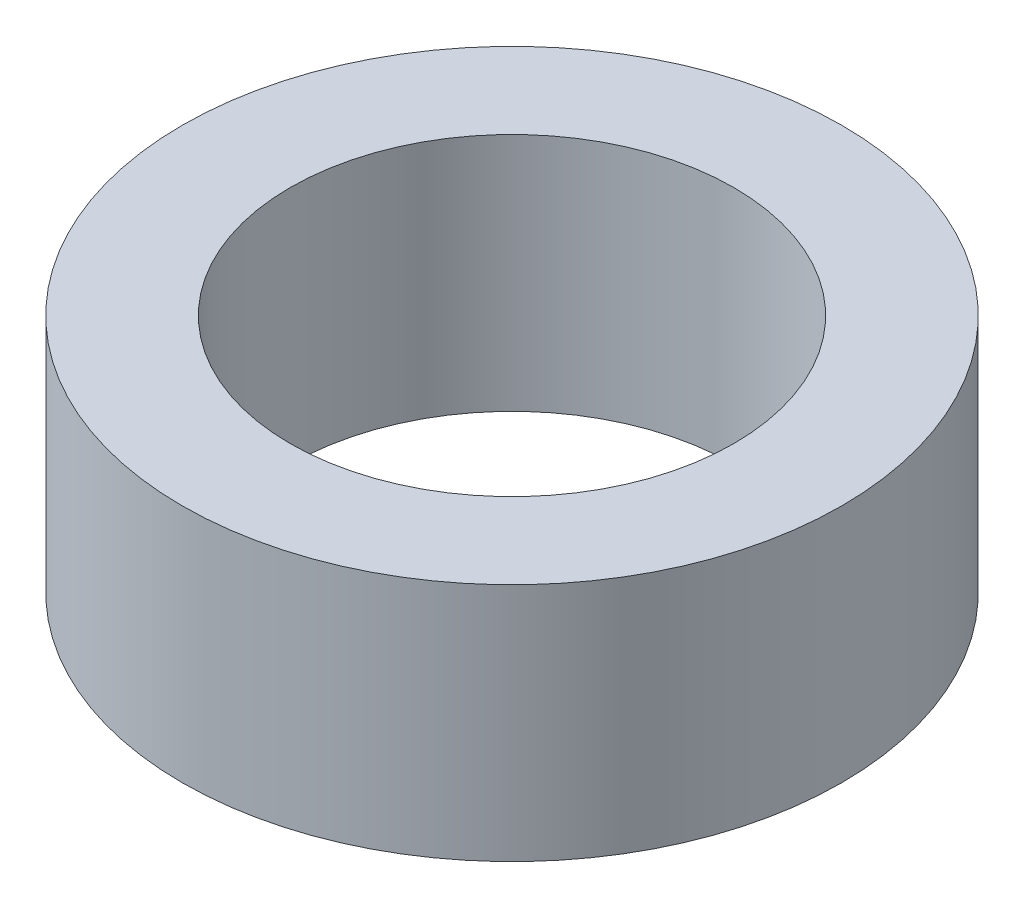
ISO-10303-21;
HEADER;
FILE_DESCRIPTION(('STEP AP214'),'2;1');
FILE_NAME('part.step','',(''),(''),'','','');
FILE_SCHEMA(('AUTOMOTIVE_DESIGN { 1 0 10303 214 1 1 1 1 }'));
ENDSEC;
DATA;
#1=APPLICATION_CONTEXT('core data for automotive mechanical design processes');
#2=APPLICATION_PROTOCOL_DEFINITION('international standard','automotive_design',2000,#1);
#3=PRODUCT_CONTEXT('',#1,'mechanical');
#4=PRODUCT('Part','Part','',(#3));
#5=PRODUCT_RELATED_PRODUCT_CATEGORY('part','',(#4));
#6=PRODUCT_DEFINITION_FORMATION('','',#4);
#7=PRODUCT_DEFINITION_CONTEXT('part definition',#1,'design');
#8=PRODUCT_DEFINITION('design','',#6,#7);
#9=PRODUCT_DEFINITION_SHAPE('','',#8);
#10=(LENGTH_UNIT() NAMED_UNIT(*) SI_UNIT(.MILLI.,.METRE.));
#11=(NAMED_UNIT(*) PLANE_ANGLE_UNIT() SI_UNIT($,.RADIAN.));
#12=(NAMED_UNIT(*) SI_UNIT($,.STERADIAN.) SOLID_ANGLE_UNIT());
#13=UNCERTAINTY_MEASURE_WITH_UNIT(LENGTH_MEASURE(1.E-05),#10,'distance_accuracy_value','');
#14=(GEOMETRIC_REPRESENTATION_CONTEXT(3) GLOBAL_UNCERTAINTY_ASSIGNED_CONTEXT((#13)) GLOBAL_UNIT_ASSIGNED_CONTEXT((#10,
#11,#12)) REPRESENTATION_CONTEXT('',''));
#15=CARTESIAN_POINT('',(0.,0.,0.));
#16=DIRECTION('',(0.,0.,1.));
#17=DIRECTION('',(1.,0.,0.));
#18=AXIS2_PLACEMENT_3D('',#15,#16,#17);
#19=CARTESIAN_POINT('',(0.,5.08,0.));
#20=DIRECTION('',(0.,1.,0.));
#21=DIRECTION('',(0.,0.,1.));
#22=AXIS2_PLACEMENT_3D('',#19,#20,#21);
#23=PLANE('',#22);
#24=CARTESIAN_POINT('',(0.,5.08,0.));
#25=DIRECTION('',(0.,1.,0.));
#26=DIRECTION('',(0.,0.,1.));
#27=AXIS2_PLACEMENT_3D('',#24,#25,#26);
#28=CIRCLE('',#27,6.985);
#29=CARTESIAN_POINT('',(0.,5.08,6.985));
#30=VERTEX_POINT('',#29);
#31=EDGE_CURVE('E10',#30,#30,#28,.T.);
#32=ORIENTED_EDGE('',*,*,#31,.T.);
#33=EDGE_LOOP('',(#32));
#34=FACE_BOUND('',#33,.T.);
#35=CARTESIAN_POINT('',(0.,5.08,0.));
#36=DIRECTION('',(0.,1.,0.));
#37=DIRECTION('',(0.,0.,1.));
#38=AXIS2_PLACEMENT_3D('',#35,#36,#37);
#39=CIRCLE('',#38,4.699);
#40=CARTESIAN_POINT('',(0.,5.08,4.699));
#41=VERTEX_POINT('',#40);
#42=EDGE_CURVE('E48',#41,#41,#39,.T.);
#43=ORIENTED_EDGE('',*,*,#42,.F.);
#44=EDGE_LOOP('',(#43));
#45=FACE_BOUND('',#44,.T.);
#46=ADVANCED_FACE('F37',(#34,#45),#23,.T.);
#47=CARTESIAN_POINT('',(0.,0.,0.));
#48=DIRECTION('',(0.,1.,0.));
#49=DIRECTION('',(0.,0.,1.));
#50=AXIS2_PLACEMENT_3D('',#47,#48,#49);
#51=PLANE('',#50);
#52=CARTESIAN_POINT('',(0.,0.,0.));
#53=DIRECTION('',(0.,1.,0.));
#54=DIRECTION('',(0.,0.,1.));
#55=AXIS2_PLACEMENT_3D('',#52,#53,#54);
#56=CIRCLE('',#55,6.985);
#57=CARTESIAN_POINT('',(0.,0.,6.985));
#58=VERTEX_POINT('',#57);
#59=EDGE_CURVE('E41',#58,#58,#56,.T.);
#60=ORIENTED_EDGE('',*,*,#59,.F.);
#61=EDGE_LOOP('',(#60));
#62=FACE_BOUND('',#61,.T.);
#63=CARTESIAN_POINT('',(0.,0.,0.));
#64=DIRECTION('',(0.,1.,0.));
#65=DIRECTION('',(0.,0.,1.));
#66=AXIS2_PLACEMENT_3D('',#63,#64,#65);
#67=CIRCLE('',#66,4.699);
#68=CARTESIAN_POINT('',(0.,0.,4.699));
#69=VERTEX_POINT('',#68);
#70=EDGE_CURVE('E50',#69,#69,#67,.T.);
#71=ORIENTED_EDGE('',*,*,#70,.T.);
#72=EDGE_LOOP('',(#71));
#73=FACE_BOUND('',#72,.T.);
#74=ADVANCED_FACE('F60',(#62,#73),#51,.F.);
#75=CARTESIAN_POINT('',(0.,5.08,0.));
#76=DIRECTION('',(0.,-1.,0.));
#77=DIRECTION('',(0.,0.,-1.));
#78=AXIS2_PLACEMENT_3D('',#75,#76,#77);
#79=CYLINDRICAL_SURFACE('',#78,6.985);
#80=ORIENTED_EDGE('',*,*,#31,.F.);
#81=EDGE_LOOP('',(#80));
#82=FACE_BOUND('',#81,.T.);
#83=ORIENTED_EDGE('',*,*,#59,.T.);
#84=EDGE_LOOP('',(#83));
#85=FACE_BOUND('',#84,.T.);
#86=ADVANCED_FACE('F39',(#82,#85),#79,.T.);
#87=CARTESIAN_POINT('',(0.,5.08,0.));
#88=DIRECTION('',(0.,-1.,0.));
#89=DIRECTION('',(0.,0.,-1.));
#90=AXIS2_PLACEMENT_3D('',#87,#88,#89);
#91=CYLINDRICAL_SURFACE('',#90,4.699);
#92=ORIENTED_EDGE('',*,*,#42,.T.);
#93=EDGE_LOOP('',(#92));
#94=FACE_BOUND('',#93,.T.);
#95=ORIENTED_EDGE('',*,*,#70,.F.);
#96=EDGE_LOOP('',(#95));
#97=FACE_BOUND('',#96,.T.);
#98=ADVANCED_FACE('F56',(#94,#97),#91,.F.);
#99=CLOSED_SHELL('',(#46,#74,#86,#98));
#100=MANIFOLD_SOLID_BREP('B2',#99);
#101=ADVANCED_BREP_SHAPE_REPRESENTATION('',(#18,#100),#14);
#102=SHAPE_DEFINITION_REPRESENTATION(#9,#101);
ENDSEC;
END-ISO-10303-21;
